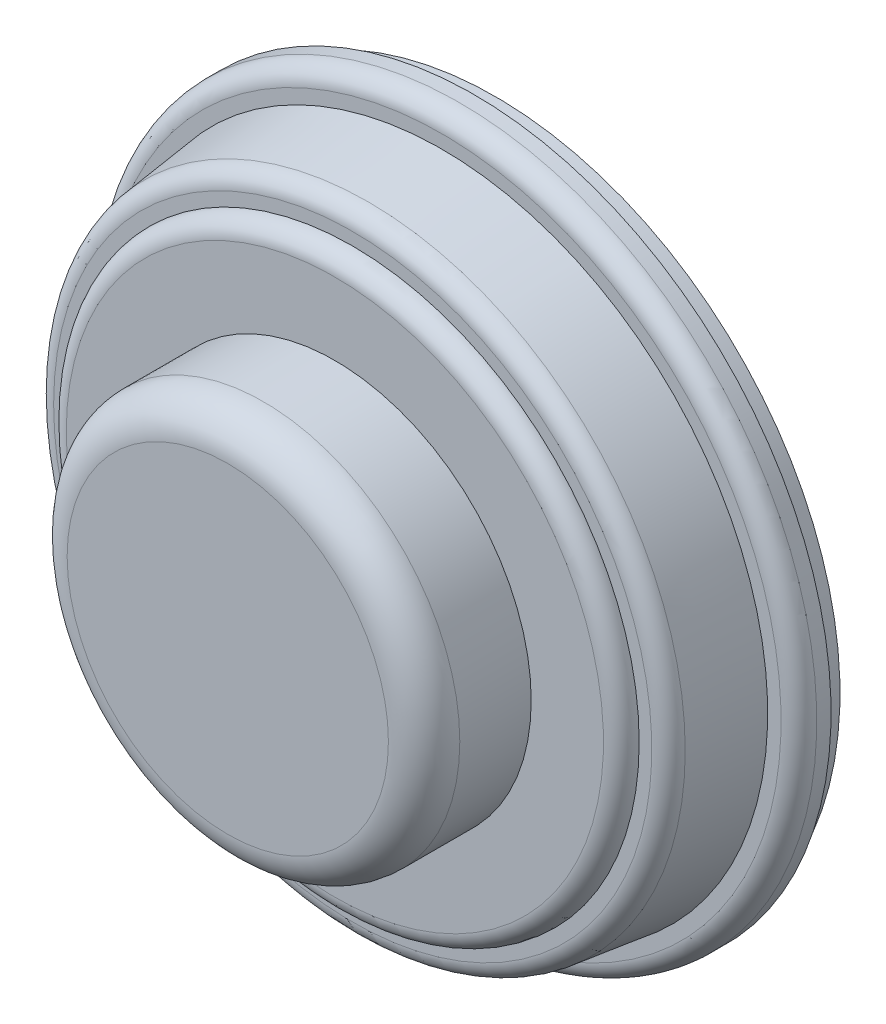
ISO-10303-21;
HEADER;
FILE_DESCRIPTION(('STEP AP214'),'2;1');
FILE_NAME('part.step','',(''),(''),'','','');
FILE_SCHEMA(('AUTOMOTIVE_DESIGN { 1 0 10303 214 1 1 1 1 }'));
ENDSEC;
DATA;
#1=APPLICATION_CONTEXT('core data for automotive mechanical design processes');
#2=APPLICATION_PROTOCOL_DEFINITION('international standard','automotive_design',2000,#1);
#3=PRODUCT_CONTEXT('',#1,'mechanical');
#4=PRODUCT('Part','Part','',(#3));
#5=PRODUCT_RELATED_PRODUCT_CATEGORY('part','',(#4));
#6=PRODUCT_DEFINITION_FORMATION('','',#4);
#7=PRODUCT_DEFINITION_CONTEXT('part definition',#1,'design');
#8=PRODUCT_DEFINITION('design','',#6,#7);
#9=PRODUCT_DEFINITION_SHAPE('','',#8);
#10=(LENGTH_UNIT() NAMED_UNIT(*) SI_UNIT(.MILLI.,.METRE.));
#11=(NAMED_UNIT(*) PLANE_ANGLE_UNIT() SI_UNIT($,.RADIAN.));
#12=(NAMED_UNIT(*) SI_UNIT($,.STERADIAN.) SOLID_ANGLE_UNIT());
#13=UNCERTAINTY_MEASURE_WITH_UNIT(LENGTH_MEASURE(1.E-05),#10,'distance_accuracy_value','');
#14=(GEOMETRIC_REPRESENTATION_CONTEXT(3) GLOBAL_UNCERTAINTY_ASSIGNED_CONTEXT((#13)) GLOBAL_UNIT_ASSIGNED_CONTEXT((#10,
#11,#12)) REPRESENTATION_CONTEXT('',''));
#15=CARTESIAN_POINT('',(0.,0.,0.));
#16=DIRECTION('',(0.,0.,1.));
#17=DIRECTION('',(1.,0.,0.));
#18=AXIS2_PLACEMENT_3D('',#15,#16,#17);
#19=CARTESIAN_POINT('',(0.,0.,20.9695652173913));
#20=DIRECTION('',(0.,0.,-1.));
#21=DIRECTION('',(1.,0.,0.));
#22=AXIS2_PLACEMENT_3D('',#19,#20,#21);
#23=SPHERICAL_SURFACE('',#22,20.7695652173913);
#24=CARTESIAN_POINT('',(0.,0.,2.5));
#25=DIRECTION('',(0.,0.,-1.));
#26=DIRECTION('',(-1.,0.,0.));
#27=AXIS2_PLACEMENT_3D('',#24,#25,#26);
#28=CIRCLE('',#27,9.5);
#29=CARTESIAN_POINT('',(-9.5,0.,2.5));
#30=VERTEX_POINT('',#29);
#31=EDGE_CURVE('E10',#30,#30,#28,.T.);
#32=ORIENTED_EDGE('',*,*,#31,.T.);
#33=EDGE_LOOP('',(#32));
#34=FACE_BOUND('',#33,.T.);
#35=ADVANCED_FACE('F33',(#34),#23,.T.);
#36=CARTESIAN_POINT('',(9.5,0.,2.5));
#37=DIRECTION('',(0.,0.,1.));
#38=DIRECTION('',(1.,0.,0.));
#39=AXIS2_PLACEMENT_3D('',#36,#37,#38);
#40=PLANE('',#39);
#41=ORIENTED_EDGE('',*,*,#31,.F.);
#42=EDGE_LOOP('',(#41));
#43=FACE_BOUND('',#42,.T.);
#44=CARTESIAN_POINT('',(0.,0.,2.5));
#45=DIRECTION('',(0.,0.,-1.));
#46=DIRECTION('',(-1.,0.,0.));
#47=AXIS2_PLACEMENT_3D('',#44,#45,#46);
#48=CIRCLE('',#47,12.5);
#49=CARTESIAN_POINT('',(-12.5,0.,2.5));
#50=VERTEX_POINT('',#49);
#51=EDGE_CURVE('E39',#50,#50,#48,.T.);
#52=ORIENTED_EDGE('',*,*,#51,.T.);
#53=EDGE_LOOP('',(#52));
#54=FACE_BOUND('',#53,.T.);
#55=ADVANCED_FACE('F107',(#43,#54),#40,.F.);
#56=CARTESIAN_POINT('',(0.,0.,3.255625));
#57=DIRECTION('',(0.,0.,-1.));
#58=DIRECTION('',(-1.,0.,0.));
#59=AXIS2_PLACEMENT_3D('',#56,#57,#58);
#60=TOROIDAL_SURFACE('',#59,15.15,2.755625);
#61=ORIENTED_EDGE('',*,*,#51,.F.);
#62=EDGE_LOOP('',(#61));
#63=FACE_BOUND('',#62,.T.);
#64=CARTESIAN_POINT('',(0.,0.,2.5));
#65=DIRECTION('',(0.,0.,-1.));
#66=DIRECTION('',(-1.,0.,0.));
#67=AXIS2_PLACEMENT_3D('',#64,#65,#66);
#68=CIRCLE('',#67,17.8);
#69=CARTESIAN_POINT('',(-17.8,0.,2.5));
#70=VERTEX_POINT('',#69);
#71=EDGE_CURVE('E43',#70,#70,#68,.T.);
#72=ORIENTED_EDGE('',*,*,#71,.T.);
#73=EDGE_LOOP('',(#72));
#74=FACE_BOUND('',#73,.T.);
#75=ADVANCED_FACE('F111',(#63,#74),#60,.T.);
#76=CARTESIAN_POINT('',(17.8,0.,2.5));
#77=DIRECTION('',(0.,0.,1.));
#78=DIRECTION('',(1.,0.,0.));
#79=AXIS2_PLACEMENT_3D('',#76,#77,#78);
#80=PLANE('',#79);
#81=ORIENTED_EDGE('',*,*,#71,.F.);
#82=EDGE_LOOP('',(#81));
#83=FACE_BOUND('',#82,.T.);
#84=CARTESIAN_POINT('',(0.,0.,2.5));
#85=DIRECTION('',(0.,0.,-1.));
#86=DIRECTION('',(-1.,0.,0.));
#87=AXIS2_PLACEMENT_3D('',#84,#85,#86);
#88=CIRCLE('',#87,18.3);
#89=CARTESIAN_POINT('',(-18.3,0.,2.5));
#90=VERTEX_POINT('',#89);
#91=EDGE_CURVE('E47',#90,#90,#88,.T.);
#92=ORIENTED_EDGE('',*,*,#91,.T.);
#93=EDGE_LOOP('',(#92));
#94=FACE_BOUND('',#93,.T.);
#95=ADVANCED_FACE('F116',(#83,#94),#80,.F.);
#96=CARTESIAN_POINT('',(0.,0.,0.));
#97=DIRECTION('',(0.,0.,-1.));
#98=DIRECTION('',(-1.,0.,0.));
#99=AXIS2_PLACEMENT_3D('',#96,#97,#98);
#100=CYLINDRICAL_SURFACE('',#99,18.3);
#101=ORIENTED_EDGE('',*,*,#91,.F.);
#102=EDGE_LOOP('',(#101));
#103=FACE_BOUND('',#102,.T.);
#104=CARTESIAN_POINT('',(0.,0.,0.));
#105=DIRECTION('',(0.,0.,-1.));
#106=DIRECTION('',(-1.,0.,0.));
#107=AXIS2_PLACEMENT_3D('',#104,#105,#106);
#108=CIRCLE('',#107,18.3);
#109=CARTESIAN_POINT('',(-18.3,0.,0.));
#110=VERTEX_POINT('',#109);
#111=EDGE_CURVE('E52',#110,#110,#108,.T.);
#112=ORIENTED_EDGE('',*,*,#111,.T.);
#113=EDGE_LOOP('',(#112));
#114=FACE_BOUND('',#113,.T.);
#115=ADVANCED_FACE('F122',(#103,#114),#100,.F.);
#116=CARTESIAN_POINT('',(18.3,0.,0.));
#117=DIRECTION('',(0.,0.,1.));
#118=DIRECTION('',(1.,0.,0.));
#119=AXIS2_PLACEMENT_3D('',#116,#117,#118);
#120=PLANE('',#119);
#121=ORIENTED_EDGE('',*,*,#111,.F.);
#122=EDGE_LOOP('',(#121));
#123=FACE_BOUND('',#122,.T.);
#124=CARTESIAN_POINT('',(0.,0.,0.));
#125=DIRECTION('',(0.,0.,-1.));
#126=DIRECTION('',(-1.,0.,0.));
#127=AXIS2_PLACEMENT_3D('',#124,#125,#126);
#128=CIRCLE('',#127,19.3);
#129=CARTESIAN_POINT('',(-19.3,0.,0.));
#130=VERTEX_POINT('',#129);
#131=EDGE_CURVE('E55',#130,#130,#128,.T.);
#132=ORIENTED_EDGE('',*,*,#131,.T.);
#133=EDGE_LOOP('',(#132));
#134=FACE_BOUND('',#133,.T.);
#135=ADVANCED_FACE('F126',(#123,#134),#120,.F.);
#136=CARTESIAN_POINT('',(0.,0.,0.));
#137=DIRECTION('',(0.,0.,-1.));
#138=DIRECTION('',(-1.,0.,0.));
#139=AXIS2_PLACEMENT_3D('',#136,#137,#138);
#140=CYLINDRICAL_SURFACE('',#139,19.3);
#141=ORIENTED_EDGE('',*,*,#131,.F.);
#142=EDGE_LOOP('',(#141));
#143=FACE_BOUND('',#142,.T.);
#144=CARTESIAN_POINT('',(0.,0.,1.2));
#145=DIRECTION('',(0.,0.,-1.));
#146=DIRECTION('',(-1.,0.,0.));
#147=AXIS2_PLACEMENT_3D('',#144,#145,#146);
#148=CIRCLE('',#147,19.3);
#149=CARTESIAN_POINT('',(-19.3,0.,1.2));
#150=VERTEX_POINT('',#149);
#151=EDGE_CURVE('E58',#150,#150,#148,.T.);
#152=ORIENTED_EDGE('',*,*,#151,.T.);
#153=EDGE_LOOP('',(#152));
#154=FACE_BOUND('',#153,.T.);
#155=ADVANCED_FACE('F130',(#143,#154),#140,.T.);
#156=CARTESIAN_POINT('',(19.3,0.,1.2));
#157=DIRECTION('',(0.,0.,1.));
#158=DIRECTION('',(1.,0.,0.));
#159=AXIS2_PLACEMENT_3D('',#156,#157,#158);
#160=PLANE('',#159);
#161=ORIENTED_EDGE('',*,*,#151,.F.);
#162=EDGE_LOOP('',(#161));
#163=FACE_BOUND('',#162,.T.);
#164=CARTESIAN_POINT('',(0.,0.,1.2));
#165=DIRECTION('',(0.,0.,-1.));
#166=DIRECTION('',(-1.,0.,0.));
#167=AXIS2_PLACEMENT_3D('',#164,#165,#166);
#168=CIRCLE('',#167,20.);
#169=CARTESIAN_POINT('',(-20.,0.,1.2));
#170=VERTEX_POINT('',#169);
#171=EDGE_CURVE('E61',#170,#170,#168,.T.);
#172=ORIENTED_EDGE('',*,*,#171,.T.);
#173=EDGE_LOOP('',(#172));
#174=FACE_BOUND('',#173,.T.);
#175=ADVANCED_FACE('F134',(#163,#174),#160,.F.);
#176=CARTESIAN_POINT('',(0.,0.,0.));
#177=DIRECTION('',(0.,0.,-1.));
#178=DIRECTION('',(-1.,0.,0.));
#179=AXIS2_PLACEMENT_3D('',#176,#177,#178);
#180=CYLINDRICAL_SURFACE('',#179,20.);
#181=ORIENTED_EDGE('',*,*,#171,.F.);
#182=EDGE_LOOP('',(#181));
#183=FACE_BOUND('',#182,.T.);
#184=CARTESIAN_POINT('',(0.,0.,2.));
#185=DIRECTION('',(0.,0.,-1.));
#186=DIRECTION('',(-1.,0.,0.));
#187=AXIS2_PLACEMENT_3D('',#184,#185,#186);
#188=CIRCLE('',#187,20.);
#189=CARTESIAN_POINT('',(-20.,0.,2.));
#190=VERTEX_POINT('',#189);
#191=EDGE_CURVE('E64',#190,#190,#188,.T.);
#192=ORIENTED_EDGE('',*,*,#191,.T.);
#193=EDGE_LOOP('',(#192));
#194=FACE_BOUND('',#193,.T.);
#195=ADVANCED_FACE('F138',(#183,#194),#180,.T.);
#196=CARTESIAN_POINT('',(0.,0.,2.));
#197=DIRECTION('',(0.,0.,-1.));
#198=DIRECTION('',(-1.,0.,0.));
#199=AXIS2_PLACEMENT_3D('',#196,#197,#198);
#200=TOROIDAL_SURFACE('',#199,19.,1.);
#201=ORIENTED_EDGE('',*,*,#191,.F.);
#202=EDGE_LOOP('',(#201));
#203=FACE_BOUND('',#202,.T.);
#204=CARTESIAN_POINT('',(0.,0.,3.));
#205=DIRECTION('',(0.,0.,-1.));
#206=DIRECTION('',(-1.,0.,0.));
#207=AXIS2_PLACEMENT_3D('',#204,#205,#206);
#208=CIRCLE('',#207,19.);
#209=CARTESIAN_POINT('',(-19.,0.,3.));
#210=VERTEX_POINT('',#209);
#211=EDGE_CURVE('E67',#210,#210,#208,.T.);
#212=ORIENTED_EDGE('',*,*,#211,.T.);
#213=EDGE_LOOP('',(#212));
#214=FACE_BOUND('',#213,.T.);
#215=ADVANCED_FACE('F142',(#203,#214),#200,.T.);
#216=CARTESIAN_POINT('',(19.,0.,3.));
#217=DIRECTION('',(0.,0.,-1.));
#218=DIRECTION('',(-1.,0.,0.));
#219=AXIS2_PLACEMENT_3D('',#216,#217,#218);
#220=PLANE('',#219);
#221=ORIENTED_EDGE('',*,*,#211,.F.);
#222=EDGE_LOOP('',(#221));
#223=FACE_BOUND('',#222,.T.);
#224=CARTESIAN_POINT('',(0.,0.,3.));
#225=DIRECTION('',(0.,0.,-1.));
#226=DIRECTION('',(-1.,0.,0.));
#227=AXIS2_PLACEMENT_3D('',#224,#225,#226);
#228=CIRCLE('',#227,18.25);
#229=CARTESIAN_POINT('',(-18.25,0.,3.));
#230=VERTEX_POINT('',#229);
#231=EDGE_CURVE('E70',#230,#230,#228,.T.);
#232=ORIENTED_EDGE('',*,*,#231,.T.);
#233=EDGE_LOOP('',(#232));
#234=FACE_BOUND('',#233,.T.);
#235=ADVANCED_FACE('F146',(#223,#234),#220,.F.);
#236=CARTESIAN_POINT('',(0.,0.,7.12046197119492));
#237=DIRECTION('',(0.,0.,-1.));
#238=DIRECTION('',(-1.,0.,0.));
#239=AXIS2_PLACEMENT_3D('',#236,#237,#238);
#240=CONICAL_SURFACE('',#239,17.75,0.120755229245998);
#241=ORIENTED_EDGE('',*,*,#231,.F.);
#242=EDGE_LOOP('',(#241));
#243=FACE_BOUND('',#242,.T.);
#244=CARTESIAN_POINT('',(0.,0.,7.12046197119492));
#245=DIRECTION('',(0.,0.,-1.));
#246=DIRECTION('',(-1.,0.,0.));
#247=AXIS2_PLACEMENT_3D('',#244,#245,#246);
#248=CIRCLE('',#247,17.75);
#249=CARTESIAN_POINT('',(-17.75,0.,7.12046197119492));
#250=VERTEX_POINT('',#249);
#251=EDGE_CURVE('E73',#250,#250,#248,.T.);
#252=ORIENTED_EDGE('',*,*,#251,.T.);
#253=EDGE_LOOP('',(#252));
#254=FACE_BOUND('',#253,.T.);
#255=ADVANCED_FACE('F150',(#243,#254),#240,.T.);
#256=CARTESIAN_POINT('',(0.,0.,7.));
#257=DIRECTION('',(0.,0.,-1.));
#258=DIRECTION('',(-1.,0.,0.));
#259=AXIS2_PLACEMENT_3D('',#256,#257,#258);
#260=TOROIDAL_SURFACE('',#259,16.7572820574323,0.999999999999999);
#261=ORIENTED_EDGE('',*,*,#251,.F.);
#262=EDGE_LOOP('',(#261));
#263=FACE_BOUND('',#262,.T.);
#264=CARTESIAN_POINT('',(0.,0.,7.99999999999999));
#265=DIRECTION('',(0.,0.,-1.));
#266=DIRECTION('',(-1.,0.,0.));
#267=AXIS2_PLACEMENT_3D('',#264,#265,#266);
#268=CIRCLE('',#267,16.7572820574323);
#269=CARTESIAN_POINT('',(-16.7572820574323,0.,7.99999999999999));
#270=VERTEX_POINT('',#269);
#271=EDGE_CURVE('E76',#270,#270,#268,.T.);
#272=ORIENTED_EDGE('',*,*,#271,.T.);
#273=EDGE_LOOP('',(#272));
#274=FACE_BOUND('',#273,.T.);
#275=ADVANCED_FACE('F154',(#263,#274),#260,.T.);
#276=CARTESIAN_POINT('',(16.7572820574323,0.,8.));
#277=DIRECTION('',(0.,0.,-1.));
#278=DIRECTION('',(-1.,0.,0.));
#279=AXIS2_PLACEMENT_3D('',#276,#277,#278);
#280=PLANE('',#279);
#281=ORIENTED_EDGE('',*,*,#271,.F.);
#282=EDGE_LOOP('',(#281));
#283=FACE_BOUND('',#282,.T.);
#284=CARTESIAN_POINT('',(0.,0.,8.));
#285=DIRECTION('',(0.,0.,-1.));
#286=DIRECTION('',(-1.,0.,0.));
#287=AXIS2_PLACEMENT_3D('',#284,#285,#286);
#288=CIRCLE('',#287,16.05);
#289=CARTESIAN_POINT('',(-16.05,0.,8.));
#290=VERTEX_POINT('',#289);
#291=EDGE_CURVE('E79',#290,#290,#288,.T.);
#292=ORIENTED_EDGE('',*,*,#291,.T.);
#293=EDGE_LOOP('',(#292));
#294=FACE_BOUND('',#293,.T.);
#295=ADVANCED_FACE('F158',(#283,#294),#280,.F.);
#296=CARTESIAN_POINT('',(0.,0.,8.));
#297=DIRECTION('',(0.,0.,-1.));
#298=DIRECTION('',(-1.,0.,0.));
#299=AXIS2_PLACEMENT_3D('',#296,#297,#298);
#300=TOROIDAL_SURFACE('',#299,15.05,1.00000000000001);
#301=ORIENTED_EDGE('',*,*,#291,.F.);
#302=EDGE_LOOP('',(#301));
#303=FACE_BOUND('',#302,.T.);
#304=CARTESIAN_POINT('',(0.,0.,9.));
#305=DIRECTION('',(0.,0.,-1.));
#306=DIRECTION('',(-1.,0.,0.));
#307=AXIS2_PLACEMENT_3D('',#304,#305,#306);
#308=CIRCLE('',#307,15.05);
#309=CARTESIAN_POINT('',(-15.05,0.,9.));
#310=VERTEX_POINT('',#309);
#311=EDGE_CURVE('E82',#310,#310,#308,.T.);
#312=ORIENTED_EDGE('',*,*,#311,.T.);
#313=EDGE_LOOP('',(#312));
#314=FACE_BOUND('',#313,.T.);
#315=ADVANCED_FACE('F162',(#303,#314),#300,.T.);
#316=CARTESIAN_POINT('',(15.05,0.,9.));
#317=DIRECTION('',(0.,0.,-1.));
#318=DIRECTION('',(-1.,0.,0.));
#319=AXIS2_PLACEMENT_3D('',#316,#317,#318);
#320=PLANE('',#319);
#321=ORIENTED_EDGE('',*,*,#311,.F.);
#322=EDGE_LOOP('',(#321));
#323=FACE_BOUND('',#322,.T.);
#324=CARTESIAN_POINT('',(0.,0.,9.));
#325=DIRECTION('',(0.,0.,-1.));
#326=DIRECTION('',(-1.,0.,0.));
#327=AXIS2_PLACEMENT_3D('',#324,#325,#326);
#328=CIRCLE('',#327,11.);
#329=CARTESIAN_POINT('',(-11.,0.,9.));
#330=VERTEX_POINT('',#329);
#331=EDGE_CURVE('E85',#330,#330,#328,.T.);
#332=ORIENTED_EDGE('',*,*,#331,.T.);
#333=EDGE_LOOP('',(#332));
#334=FACE_BOUND('',#333,.T.);
#335=ADVANCED_FACE('F166',(#323,#334),#320,.F.);
#336=CARTESIAN_POINT('',(0.,0.,0.));
#337=DIRECTION('',(0.,0.,-1.));
#338=DIRECTION('',(-1.,0.,0.));
#339=AXIS2_PLACEMENT_3D('',#336,#337,#338);
#340=CYLINDRICAL_SURFACE('',#339,11.);
#341=ORIENTED_EDGE('',*,*,#331,.F.);
#342=EDGE_LOOP('',(#341));
#343=FACE_BOUND('',#342,.T.);
#344=CARTESIAN_POINT('',(0.,0.,13.));
#345=DIRECTION('',(0.,0.,-1.));
#346=DIRECTION('',(-1.,0.,0.));
#347=AXIS2_PLACEMENT_3D('',#344,#345,#346);
#348=CIRCLE('',#347,11.);
#349=CARTESIAN_POINT('',(-11.,0.,13.));
#350=VERTEX_POINT('',#349);
#351=EDGE_CURVE('E88',#350,#350,#348,.T.);
#352=ORIENTED_EDGE('',*,*,#351,.T.);
#353=EDGE_LOOP('',(#352));
#354=FACE_BOUND('',#353,.T.);
#355=ADVANCED_FACE('F103',(#343,#354),#340,.T.);
#356=CARTESIAN_POINT('',(0.,0.,13.));
#357=DIRECTION('',(0.,0.,-1.));
#358=DIRECTION('',(-1.,0.,0.));
#359=AXIS2_PLACEMENT_3D('',#356,#357,#358);
#360=TOROIDAL_SURFACE('',#359,9.,2.);
#361=ORIENTED_EDGE('',*,*,#351,.F.);
#362=EDGE_LOOP('',(#361));
#363=FACE_BOUND('',#362,.T.);
#364=CARTESIAN_POINT('',(0.,0.,15.));
#365=DIRECTION('',(0.,0.,-1.));
#366=DIRECTION('',(-1.,0.,0.));
#367=AXIS2_PLACEMENT_3D('',#364,#365,#366);
#368=CIRCLE('',#367,9.);
#369=CARTESIAN_POINT('',(-9.,0.,15.));
#370=VERTEX_POINT('',#369);
#371=EDGE_CURVE('E91',#370,#370,#368,.T.);
#372=ORIENTED_EDGE('',*,*,#371,.T.);
#373=EDGE_LOOP('',(#372));
#374=FACE_BOUND('',#373,.T.);
#375=ADVANCED_FACE('F95',(#363,#374),#360,.T.);
#376=CARTESIAN_POINT('',(9.,0.,15.));
#377=DIRECTION('',(0.,0.,-1.));
#378=DIRECTION('',(-1.,0.,0.));
#379=AXIS2_PLACEMENT_3D('',#376,#377,#378);
#380=PLANE('',#379);
#381=ORIENTED_EDGE('',*,*,#371,.F.);
#382=EDGE_LOOP('',(#381));
#383=FACE_BOUND('',#382,.T.);
#384=ADVANCED_FACE('F97',(#383),#380,.F.);
#385=CLOSED_SHELL('',(#35,#55,#75,#95,#115,#135,#155,#175,#195,#215,#235,#255,#275,#295,#315,
#335,#355,#375,#384));
#386=MANIFOLD_SOLID_BREP('B2',#385);
#387=ADVANCED_BREP_SHAPE_REPRESENTATION('',(#18,#386),#14);
#388=SHAPE_DEFINITION_REPRESENTATION(#9,#387);
ENDSEC;
END-ISO-10303-21;
